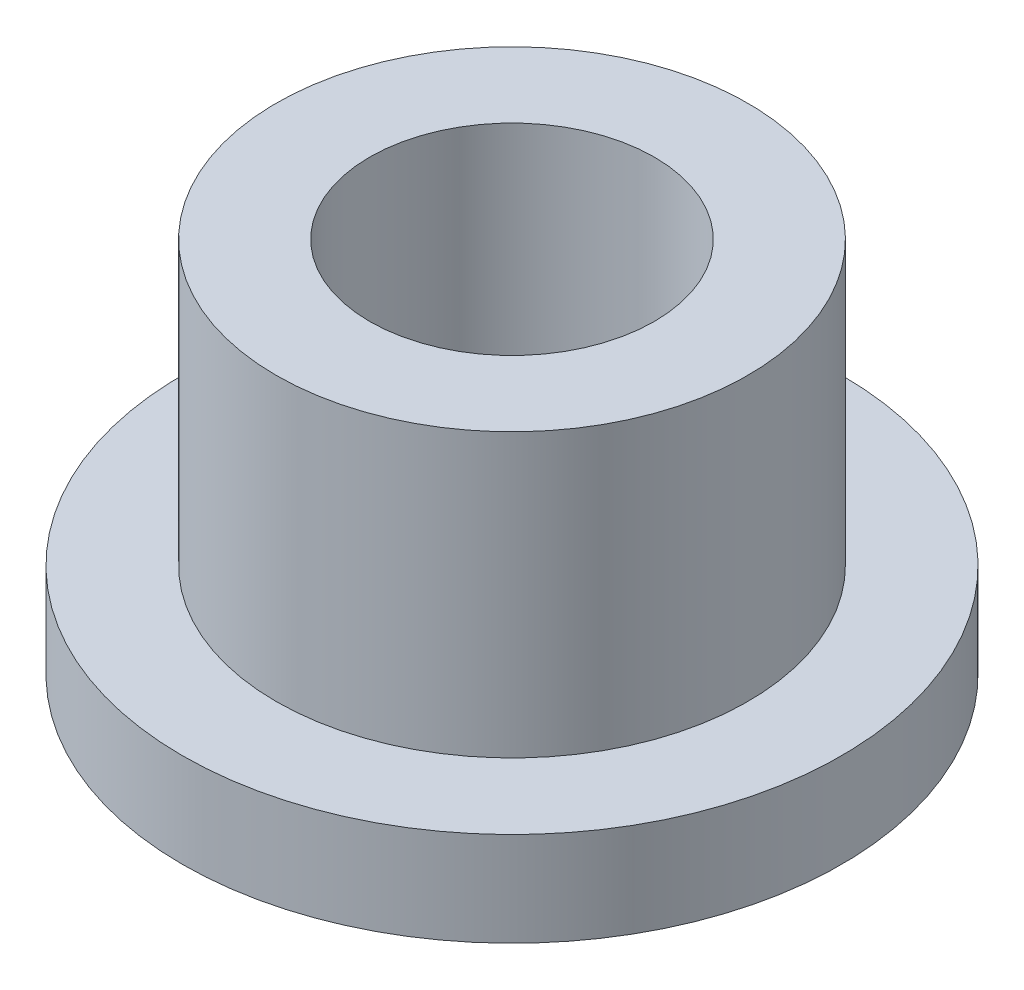
ISO-10303-21;
HEADER;
FILE_DESCRIPTION(('STEP AP214'),'2;1');
FILE_NAME('part.step','',(''),(''),'','','');
FILE_SCHEMA(('AUTOMOTIVE_DESIGN { 1 0 10303 214 1 1 1 1 }'));
ENDSEC;
DATA;
#1=APPLICATION_CONTEXT('core data for automotive mechanical design processes');
#2=APPLICATION_PROTOCOL_DEFINITION('international standard','automotive_design',2000,#1);
#3=PRODUCT_CONTEXT('',#1,'mechanical');
#4=PRODUCT('Part','Part','',(#3));
#5=PRODUCT_RELATED_PRODUCT_CATEGORY('part','',(#4));
#6=PRODUCT_DEFINITION_FORMATION('','',#4);
#7=PRODUCT_DEFINITION_CONTEXT('part definition',#1,'design');
#8=PRODUCT_DEFINITION('design','',#6,#7);
#9=PRODUCT_DEFINITION_SHAPE('','',#8);
#10=(LENGTH_UNIT() NAMED_UNIT(*) SI_UNIT(.MILLI.,.METRE.));
#11=(NAMED_UNIT(*) PLANE_ANGLE_UNIT() SI_UNIT($,.RADIAN.));
#12=(NAMED_UNIT(*) SI_UNIT($,.STERADIAN.) SOLID_ANGLE_UNIT());
#13=UNCERTAINTY_MEASURE_WITH_UNIT(LENGTH_MEASURE(1.E-05),#10,'distance_accuracy_value','');
#14=(GEOMETRIC_REPRESENTATION_CONTEXT(3) GLOBAL_UNCERTAINTY_ASSIGNED_CONTEXT((#13)) GLOBAL_UNIT_ASSIGNED_CONTEXT((#10,
#11,#12)) REPRESENTATION_CONTEXT('',''));
#15=CARTESIAN_POINT('',(0.,0.,0.));
#16=DIRECTION('',(0.,0.,1.));
#17=DIRECTION('',(1.,0.,0.));
#18=AXIS2_PLACEMENT_3D('',#15,#16,#17);
#19=CARTESIAN_POINT('',(0.,6.35,0.));
#20=DIRECTION('',(0.,1.,0.));
#21=DIRECTION('',(0.,0.,1.));
#22=AXIS2_PLACEMENT_3D('',#19,#20,#21);
#23=PLANE('',#22);
#24=CARTESIAN_POINT('',(0.,6.35,0.));
#25=DIRECTION('',(0.,1.,0.));
#26=DIRECTION('',(0.,0.,1.));
#27=AXIS2_PLACEMENT_3D('',#24,#25,#26);
#28=CIRCLE('',#27,3.9751);
#29=CARTESIAN_POINT('',(0.,6.35,3.9751));
#30=VERTEX_POINT('',#29);
#31=EDGE_CURVE('E10',#30,#30,#28,.T.);
#32=ORIENTED_EDGE('',*,*,#31,.T.);
#33=EDGE_LOOP('',(#32));
#34=FACE_BOUND('',#33,.T.);
#35=CARTESIAN_POINT('',(0.,6.35,0.));
#36=DIRECTION('',(0.,1.,0.));
#37=DIRECTION('',(0.,0.,1.));
#38=AXIS2_PLACEMENT_3D('',#35,#36,#37);
#39=CIRCLE('',#38,2.4003);
#40=CARTESIAN_POINT('',(0.,6.35,2.4003));
#41=VERTEX_POINT('',#40);
#42=EDGE_CURVE('E38',#41,#41,#39,.T.);
#43=ORIENTED_EDGE('',*,*,#42,.F.);
#44=EDGE_LOOP('',(#43));
#45=FACE_BOUND('',#44,.T.);
#46=ADVANCED_FACE('F31',(#34,#45),#23,.T.);
#47=CARTESIAN_POINT('',(0.,0.,0.));
#48=DIRECTION('',(0.,1.,0.));
#49=DIRECTION('',(0.,0.,1.));
#50=AXIS2_PLACEMENT_3D('',#47,#48,#49);
#51=PLANE('',#50);
#52=CARTESIAN_POINT('',(0.,0.,0.));
#53=DIRECTION('',(0.,1.,0.));
#54=DIRECTION('',(0.,0.,1.));
#55=AXIS2_PLACEMENT_3D('',#52,#53,#54);
#56=CIRCLE('',#55,2.4003);
#57=CARTESIAN_POINT('',(0.,0.,2.4003));
#58=VERTEX_POINT('',#57);
#59=EDGE_CURVE('E42',#58,#58,#56,.T.);
#60=ORIENTED_EDGE('',*,*,#59,.T.);
#61=EDGE_LOOP('',(#60));
#62=FACE_BOUND('',#61,.T.);
#63=CARTESIAN_POINT('',(0.,0.,0.));
#64=DIRECTION('',(0.,1.,0.));
#65=DIRECTION('',(0.,0.,1.));
#66=AXIS2_PLACEMENT_3D('',#63,#64,#65);
#67=CIRCLE('',#66,5.55625);
#68=CARTESIAN_POINT('',(0.,0.,5.55625));
#69=VERTEX_POINT('',#68);
#70=EDGE_CURVE('E49',#69,#69,#67,.T.);
#71=ORIENTED_EDGE('',*,*,#70,.F.);
#72=EDGE_LOOP('',(#71));
#73=FACE_BOUND('',#72,.T.);
#74=ADVANCED_FACE('F74',(#62,#73),#51,.F.);
#75=CARTESIAN_POINT('',(0.,6.35,0.));
#76=DIRECTION('',(0.,-1.,0.));
#77=DIRECTION('',(0.,0.,-1.));
#78=AXIS2_PLACEMENT_3D('',#75,#76,#77);
#79=CYLINDRICAL_SURFACE('',#78,3.9751);
#80=CARTESIAN_POINT('',(0.,1.5875,0.));
#81=DIRECTION('',(0.,1.,0.));
#82=DIRECTION('',(0.,0.,1.));
#83=AXIS2_PLACEMENT_3D('',#80,#81,#82);
#84=CIRCLE('',#83,3.9751);
#85=CARTESIAN_POINT('',(0.,1.5875,3.9751));
#86=VERTEX_POINT('',#85);
#87=EDGE_CURVE('E52',#86,#86,#84,.T.);
#88=ORIENTED_EDGE('',*,*,#87,.T.);
#89=EDGE_LOOP('',(#88));
#90=FACE_BOUND('',#89,.T.);
#91=ORIENTED_EDGE('',*,*,#31,.F.);
#92=EDGE_LOOP('',(#91));
#93=FACE_BOUND('',#92,.T.);
#94=ADVANCED_FACE('F33',(#90,#93),#79,.T.);
#95=CARTESIAN_POINT('',(0.,6.35,0.));
#96=DIRECTION('',(0.,-1.,0.));
#97=DIRECTION('',(0.,0.,-1.));
#98=AXIS2_PLACEMENT_3D('',#95,#96,#97);
#99=CYLINDRICAL_SURFACE('',#98,2.4003);
#100=ORIENTED_EDGE('',*,*,#42,.T.);
#101=EDGE_LOOP('',(#100));
#102=FACE_BOUND('',#101,.T.);
#103=ORIENTED_EDGE('',*,*,#59,.F.);
#104=EDGE_LOOP('',(#103));
#105=FACE_BOUND('',#104,.T.);
#106=ADVANCED_FACE('F63',(#102,#105),#99,.F.);
#107=CARTESIAN_POINT('',(0.,1.5875,0.));
#108=DIRECTION('',(0.,1.,0.));
#109=DIRECTION('',(0.,0.,1.));
#110=AXIS2_PLACEMENT_3D('',#107,#108,#109);
#111=PLANE('',#110);
#112=CARTESIAN_POINT('',(0.,1.5875,0.));
#113=DIRECTION('',(0.,1.,0.));
#114=DIRECTION('',(0.,0.,1.));
#115=AXIS2_PLACEMENT_3D('',#112,#113,#114);
#116=CIRCLE('',#115,5.55625);
#117=CARTESIAN_POINT('',(0.,1.5875,5.55625));
#118=VERTEX_POINT('',#117);
#119=EDGE_CURVE('E47',#118,#118,#116,.T.);
#120=ORIENTED_EDGE('',*,*,#119,.T.);
#121=EDGE_LOOP('',(#120));
#122=FACE_BOUND('',#121,.T.);
#123=ORIENTED_EDGE('',*,*,#87,.F.);
#124=EDGE_LOOP('',(#123));
#125=FACE_BOUND('',#124,.T.);
#126=ADVANCED_FACE('F60',(#122,#125),#111,.T.);
#127=CARTESIAN_POINT('',(0.,1.5875,0.));
#128=DIRECTION('',(0.,-1.,0.));
#129=DIRECTION('',(0.,0.,-1.));
#130=AXIS2_PLACEMENT_3D('',#127,#128,#129);
#131=CYLINDRICAL_SURFACE('',#130,5.55625);
#132=ORIENTED_EDGE('',*,*,#119,.F.);
#133=EDGE_LOOP('',(#132));
#134=FACE_BOUND('',#133,.T.);
#135=ORIENTED_EDGE('',*,*,#70,.T.);
#136=EDGE_LOOP('',(#135));
#137=FACE_BOUND('',#136,.T.);
#138=ADVANCED_FACE('F62',(#134,#137),#131,.T.);
#139=CLOSED_SHELL('',(#46,#74,#94,#106,#126,#138));
#140=MANIFOLD_SOLID_BREP('B2',#139);
#141=ADVANCED_BREP_SHAPE_REPRESENTATION('',(#18,#140),#14);
#142=SHAPE_DEFINITION_REPRESENTATION(#9,#141);
ENDSEC;
END-ISO-10303-21;
